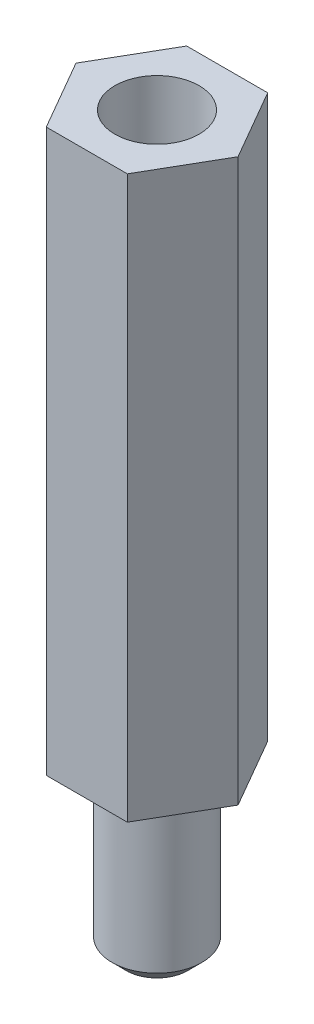
ISO-10303-21;
HEADER;
FILE_DESCRIPTION(('STEP AP214'),'2;1');
FILE_NAME('part.step','',(''),(''),'','','');
FILE_SCHEMA(('AUTOMOTIVE_DESIGN { 1 0 10303 214 1 1 1 1 }'));
ENDSEC;
DATA;
#1=APPLICATION_CONTEXT('core data for automotive mechanical design processes');
#2=APPLICATION_PROTOCOL_DEFINITION('international standard','automotive_design',2000,#1);
#3=PRODUCT_CONTEXT('',#1,'mechanical');
#4=PRODUCT('Part','Part','',(#3));
#5=PRODUCT_RELATED_PRODUCT_CATEGORY('part','',(#4));
#6=PRODUCT_DEFINITION_FORMATION('','',#4);
#7=PRODUCT_DEFINITION_CONTEXT('part definition',#1,'design');
#8=PRODUCT_DEFINITION('design','',#6,#7);
#9=PRODUCT_DEFINITION_SHAPE('','',#8);
#10=(LENGTH_UNIT() NAMED_UNIT(*) SI_UNIT(.MILLI.,.METRE.));
#11=(NAMED_UNIT(*) PLANE_ANGLE_UNIT() SI_UNIT($,.RADIAN.));
#12=(NAMED_UNIT(*) SI_UNIT($,.STERADIAN.) SOLID_ANGLE_UNIT());
#13=UNCERTAINTY_MEASURE_WITH_UNIT(LENGTH_MEASURE(1.E-05),#10,'distance_accuracy_value','');
#14=(GEOMETRIC_REPRESENTATION_CONTEXT(3) GLOBAL_UNCERTAINTY_ASSIGNED_CONTEXT((#13)) GLOBAL_UNIT_ASSIGNED_CONTEXT((#10,
#11,#12)) REPRESENTATION_CONTEXT('',''));
#15=CARTESIAN_POINT('',(0.,0.,0.));
#16=DIRECTION('',(0.,0.,1.));
#17=DIRECTION('',(1.,0.,0.));
#18=AXIS2_PLACEMENT_3D('',#15,#16,#17);
#19=CARTESIAN_POINT('',(0.,20.,0.));
#20=DIRECTION('',(0.,-1.,0.));
#21=DIRECTION('',(0.,0.,-1.));
#22=AXIS2_PLACEMENT_3D('',#19,#20,#21);
#23=CYLINDRICAL_SURFACE('',#22,1.5);
#24=CARTESIAN_POINT('',(0.,13.,0.));
#25=DIRECTION('',(0.,-1.,0.));
#26=DIRECTION('',(0.,0.,-1.));
#27=AXIS2_PLACEMENT_3D('',#24,#25,#26);
#28=CIRCLE('',#27,1.5);
#29=CARTESIAN_POINT('',(0.,13.,-1.5));
#30=VERTEX_POINT('',#29);
#31=EDGE_CURVE('E43',#30,#30,#28,.T.);
#32=ORIENTED_EDGE('',*,*,#31,.T.);
#33=EDGE_LOOP('',(#32));
#34=FACE_BOUND('',#33,.T.);
#35=CARTESIAN_POINT('',(0.,20.,0.));
#36=DIRECTION('',(0.,1.,0.));
#37=DIRECTION('',(0.,0.,1.));
#38=AXIS2_PLACEMENT_3D('',#35,#36,#37);
#39=CIRCLE('',#38,1.5);
#40=CARTESIAN_POINT('',(0.,20.,1.5));
#41=VERTEX_POINT('',#40);
#42=EDGE_CURVE('E125',#41,#41,#39,.T.);
#43=ORIENTED_EDGE('',*,*,#42,.T.);
#44=EDGE_LOOP('',(#43));
#45=FACE_BOUND('',#44,.T.);
#46=ADVANCED_FACE('F34',(#34,#45),#23,.F.);
#47=CARTESIAN_POINT('',(0.,20.,-5.));
#48=DIRECTION('',(0.,1.,0.));
#49=DIRECTION('',(0.,0.,1.));
#50=AXIS2_PLACEMENT_3D('',#47,#48,#49);
#51=PLANE('',#50);
#52=DIRECTION('',(-0.5,0.,-0.866025403784439));
#53=VECTOR('',#52,1.);
#54=CARTESIAN_POINT('',(1.44337567297406,20.,-2.5));
#55=LINE('',#54,#53);
#56=CARTESIAN_POINT('',(2.88675134594813,20.,0.));
#57=VERTEX_POINT('',#56);
#58=CARTESIAN_POINT('',(1.44337567297406,20.,-2.5));
#59=VERTEX_POINT('',#58);
#60=EDGE_CURVE('E132',#57,#59,#55,.T.);
#61=ORIENTED_EDGE('',*,*,#60,.T.);
#62=DIRECTION('',(-1.,0.,0.));
#63=VECTOR('',#62,1.);
#64=CARTESIAN_POINT('',(-1.44337567297406,20.,-2.5));
#65=LINE('',#64,#63);
#66=CARTESIAN_POINT('',(-1.44337567297406,20.,-2.5));
#67=VERTEX_POINT('',#66);
#68=EDGE_CURVE('E89',#59,#67,#65,.T.);
#69=ORIENTED_EDGE('',*,*,#68,.T.);
#70=DIRECTION('',(-0.5,0.,0.866025403784438));
#71=VECTOR('',#70,1.);
#72=CARTESIAN_POINT('',(-2.88675134594813,20.,0.));
#73=LINE('',#72,#71);
#74=CARTESIAN_POINT('',(-2.88675134594813,20.,0.));
#75=VERTEX_POINT('',#74);
#76=EDGE_CURVE('E103',#67,#75,#73,.T.);
#77=ORIENTED_EDGE('',*,*,#76,.T.);
#78=DIRECTION('',(0.5,0.,0.866025403784438));
#79=VECTOR('',#78,1.);
#80=CARTESIAN_POINT('',(-1.44337567297406,20.,2.5));
#81=LINE('',#80,#79);
#82=CARTESIAN_POINT('',(-1.44337567297406,20.,2.5));
#83=VERTEX_POINT('',#82);
#84=EDGE_CURVE('E96',#75,#83,#81,.T.);
#85=ORIENTED_EDGE('',*,*,#84,.T.);
#86=DIRECTION('',(1.,0.,0.));
#87=VECTOR('',#86,1.);
#88=CARTESIAN_POINT('',(1.44337567297406,20.,2.5));
#89=LINE('',#88,#87);
#90=CARTESIAN_POINT('',(1.44337567297406,20.,2.5));
#91=VERTEX_POINT('',#90);
#92=EDGE_CURVE('E101',#83,#91,#89,.T.);
#93=ORIENTED_EDGE('',*,*,#92,.T.);
#94=DIRECTION('',(0.5,0.,-0.866025403784439));
#95=VECTOR('',#94,1.);
#96=CARTESIAN_POINT('',(2.88675134594813,20.,0.));
#97=LINE('',#96,#95);
#98=EDGE_CURVE('E51',#91,#57,#97,.T.);
#99=ORIENTED_EDGE('',*,*,#98,.T.);
#100=EDGE_LOOP('',(#61,#69,#77,#85,#93,#99));
#101=FACE_BOUND('',#100,.T.);
#102=ORIENTED_EDGE('',*,*,#42,.F.);
#103=EDGE_LOOP('',(#102));
#104=FACE_BOUND('',#103,.T.);
#105=ADVANCED_FACE('F98',(#101,#104),#51,.T.);
#106=CARTESIAN_POINT('',(0.,0.,-5.));
#107=DIRECTION('',(0.,1.,0.));
#108=DIRECTION('',(0.,0.,1.));
#109=AXIS2_PLACEMENT_3D('',#106,#107,#108);
#110=PLANE('',#109);
#111=CARTESIAN_POINT('',(0.,0.,0.));
#112=DIRECTION('',(0.,1.,0.));
#113=DIRECTION('',(0.,0.,1.));
#114=AXIS2_PLACEMENT_3D('',#111,#112,#113);
#115=CIRCLE('',#114,2.1);
#116=CARTESIAN_POINT('',(0.,0.,2.1));
#117=VERTEX_POINT('',#116);
#118=EDGE_CURVE('E147',#117,#117,#115,.T.);
#119=ORIENTED_EDGE('',*,*,#118,.T.);
#120=EDGE_LOOP('',(#119));
#121=FACE_BOUND('',#120,.T.);
#122=DIRECTION('',(-0.5,0.,-0.866025403784439));
#123=VECTOR('',#122,1.);
#124=CARTESIAN_POINT('',(1.44337567297406,0.,-2.5));
#125=LINE('',#124,#123);
#126=CARTESIAN_POINT('',(2.88675134594813,0.,0.));
#127=VERTEX_POINT('',#126);
#128=CARTESIAN_POINT('',(1.44337567297406,0.,-2.5));
#129=VERTEX_POINT('',#128);
#130=EDGE_CURVE('E121',#127,#129,#125,.T.);
#131=ORIENTED_EDGE('',*,*,#130,.F.);
#132=DIRECTION('',(0.5,0.,-0.866025403784439));
#133=VECTOR('',#132,1.);
#134=CARTESIAN_POINT('',(2.88675134594813,0.,0.));
#135=LINE('',#134,#133);
#136=CARTESIAN_POINT('',(1.44337567297406,0.,2.5));
#137=VERTEX_POINT('',#136);
#138=EDGE_CURVE('E80',#137,#127,#135,.T.);
#139=ORIENTED_EDGE('',*,*,#138,.F.);
#140=DIRECTION('',(1.,0.,0.));
#141=VECTOR('',#140,1.);
#142=CARTESIAN_POINT('',(1.44337567297406,0.,2.5));
#143=LINE('',#142,#141);
#144=CARTESIAN_POINT('',(-1.44337567297406,0.,2.5));
#145=VERTEX_POINT('',#144);
#146=EDGE_CURVE('E74',#145,#137,#143,.T.);
#147=ORIENTED_EDGE('',*,*,#146,.F.);
#148=DIRECTION('',(0.5,0.,0.866025403784438));
#149=VECTOR('',#148,1.);
#150=CARTESIAN_POINT('',(-1.44337567297406,0.,2.5));
#151=LINE('',#150,#149);
#152=CARTESIAN_POINT('',(-2.88675134594813,0.,0.));
#153=VERTEX_POINT('',#152);
#154=EDGE_CURVE('E111',#153,#145,#151,.T.);
#155=ORIENTED_EDGE('',*,*,#154,.F.);
#156=DIRECTION('',(-0.5,0.,0.866025403784438));
#157=VECTOR('',#156,1.);
#158=CARTESIAN_POINT('',(-2.88675134594813,0.,0.));
#159=LINE('',#158,#157);
#160=CARTESIAN_POINT('',(-1.44337567297406,0.,-2.5));
#161=VERTEX_POINT('',#160);
#162=EDGE_CURVE('E127',#161,#153,#159,.T.);
#163=ORIENTED_EDGE('',*,*,#162,.F.);
#164=DIRECTION('',(-1.,0.,0.));
#165=VECTOR('',#164,1.);
#166=CARTESIAN_POINT('',(-1.44337567297406,0.,-2.5));
#167=LINE('',#166,#165);
#168=EDGE_CURVE('E124',#129,#161,#167,.T.);
#169=ORIENTED_EDGE('',*,*,#168,.F.);
#170=EDGE_LOOP('',(#131,#139,#147,#155,#163,#169));
#171=FACE_BOUND('',#170,.T.);
#172=ADVANCED_FACE('F171',(#121,#171),#110,.F.);
#173=CARTESIAN_POINT('',(1.44337567297406,20.,-2.5));
#174=DIRECTION('',(-0.866025403784439,0.,0.5));
#175=DIRECTION('',(0.5,0.,0.866025403784439));
#176=AXIS2_PLACEMENT_3D('',#173,#174,#175);
#177=PLANE('',#176);
#178=ORIENTED_EDGE('',*,*,#130,.T.);
#179=DIRECTION('',(0.,-1.,0.));
#180=VECTOR('',#179,1.);
#181=CARTESIAN_POINT('',(1.44337567297406,20.,-2.5));
#182=LINE('',#181,#180);
#183=EDGE_CURVE('E139',#59,#129,#182,.T.);
#184=ORIENTED_EDGE('',*,*,#183,.F.);
#185=ORIENTED_EDGE('',*,*,#60,.F.);
#186=DIRECTION('',(0.,-1.,0.));
#187=VECTOR('',#186,1.);
#188=CARTESIAN_POINT('',(2.88675134594813,20.,0.));
#189=LINE('',#188,#187);
#190=EDGE_CURVE('E117',#57,#127,#189,.T.);
#191=ORIENTED_EDGE('',*,*,#190,.T.);
#192=EDGE_LOOP('',(#178,#184,#185,#191));
#193=FACE_BOUND('',#192,.T.);
#194=ADVANCED_FACE('F179',(#193),#177,.F.);
#195=CARTESIAN_POINT('',(-1.44337567297406,20.,-2.5));
#196=DIRECTION('',(0.,0.,1.));
#197=DIRECTION('',(1.,0.,0.));
#198=AXIS2_PLACEMENT_3D('',#195,#196,#197);
#199=PLANE('',#198);
#200=ORIENTED_EDGE('',*,*,#168,.T.);
#201=DIRECTION('',(0.,-1.,0.));
#202=VECTOR('',#201,1.);
#203=CARTESIAN_POINT('',(-1.44337567297406,20.,-2.5));
#204=LINE('',#203,#202);
#205=EDGE_CURVE('E136',#67,#161,#204,.T.);
#206=ORIENTED_EDGE('',*,*,#205,.F.);
#207=ORIENTED_EDGE('',*,*,#68,.F.);
#208=ORIENTED_EDGE('',*,*,#183,.T.);
#209=EDGE_LOOP('',(#200,#206,#207,#208));
#210=FACE_BOUND('',#209,.T.);
#211=ADVANCED_FACE('F192',(#210),#199,.F.);
#212=CARTESIAN_POINT('',(-2.88675134594813,20.,0.));
#213=DIRECTION('',(0.866025403784439,0.,0.5));
#214=DIRECTION('',(0.5,0.,-0.866025403784439));
#215=AXIS2_PLACEMENT_3D('',#212,#213,#214);
#216=PLANE('',#215);
#217=ORIENTED_EDGE('',*,*,#162,.T.);
#218=DIRECTION('',(0.,-1.,0.));
#219=VECTOR('',#218,1.);
#220=CARTESIAN_POINT('',(-2.88675134594813,20.,0.));
#221=LINE('',#220,#219);
#222=EDGE_CURVE('E112',#75,#153,#221,.T.);
#223=ORIENTED_EDGE('',*,*,#222,.F.);
#224=ORIENTED_EDGE('',*,*,#76,.F.);
#225=ORIENTED_EDGE('',*,*,#205,.T.);
#226=EDGE_LOOP('',(#217,#223,#224,#225));
#227=FACE_BOUND('',#226,.T.);
#228=ADVANCED_FACE('F189',(#227),#216,.F.);
#229=CARTESIAN_POINT('',(-1.44337567297406,20.,2.5));
#230=DIRECTION('',(0.866025403784438,0.,-0.5));
#231=DIRECTION('',(-0.5,0.,-0.866025403784438));
#232=AXIS2_PLACEMENT_3D('',#229,#230,#231);
#233=PLANE('',#232);
#234=ORIENTED_EDGE('',*,*,#154,.T.);
#235=DIRECTION('',(0.,-1.,0.));
#236=VECTOR('',#235,1.);
#237=CARTESIAN_POINT('',(-1.44337567297406,20.,2.5));
#238=LINE('',#237,#236);
#239=EDGE_CURVE('E108',#83,#145,#238,.T.);
#240=ORIENTED_EDGE('',*,*,#239,.F.);
#241=ORIENTED_EDGE('',*,*,#84,.F.);
#242=ORIENTED_EDGE('',*,*,#222,.T.);
#243=EDGE_LOOP('',(#234,#240,#241,#242));
#244=FACE_BOUND('',#243,.T.);
#245=ADVANCED_FACE('F109',(#244),#233,.F.);
#246=CARTESIAN_POINT('',(1.44337567297406,20.,2.5));
#247=DIRECTION('',(0.,0.,-1.));
#248=DIRECTION('',(-1.,0.,0.));
#249=AXIS2_PLACEMENT_3D('',#246,#247,#248);
#250=PLANE('',#249);
#251=ORIENTED_EDGE('',*,*,#146,.T.);
#252=DIRECTION('',(0.,-1.,0.));
#253=VECTOR('',#252,1.);
#254=CARTESIAN_POINT('',(1.44337567297406,20.,2.5));
#255=LINE('',#254,#253);
#256=EDGE_CURVE('E113',#91,#137,#255,.T.);
#257=ORIENTED_EDGE('',*,*,#256,.F.);
#258=ORIENTED_EDGE('',*,*,#92,.F.);
#259=ORIENTED_EDGE('',*,*,#239,.T.);
#260=EDGE_LOOP('',(#251,#257,#258,#259));
#261=FACE_BOUND('',#260,.T.);
#262=ADVANCED_FACE('F115',(#261),#250,.F.);
#263=CARTESIAN_POINT('',(2.88675134594813,20.,0.));
#264=DIRECTION('',(-0.866025403784439,0.,-0.5));
#265=DIRECTION('',(-0.5,0.,0.866025403784439));
#266=AXIS2_PLACEMENT_3D('',#263,#264,#265);
#267=PLANE('',#266);
#268=ORIENTED_EDGE('',*,*,#138,.T.);
#269=ORIENTED_EDGE('',*,*,#190,.F.);
#270=ORIENTED_EDGE('',*,*,#98,.F.);
#271=ORIENTED_EDGE('',*,*,#256,.T.);
#272=EDGE_LOOP('',(#268,#269,#270,#271));
#273=FACE_BOUND('',#272,.T.);
#274=ADVANCED_FACE('F181',(#273),#267,.F.);
#275=CARTESIAN_POINT('',(0.,12.,0.));
#276=DIRECTION('',(0.,-1.,0.));
#277=DIRECTION('',(0.,0.,-1.));
#278=AXIS2_PLACEMENT_3D('',#275,#276,#277);
#279=PLANE('',#278);
#280=CARTESIAN_POINT('',(0.,12.,0.));
#281=DIRECTION('',(0.,-1.,0.));
#282=DIRECTION('',(0.,0.,-1.));
#283=AXIS2_PLACEMENT_3D('',#280,#281,#282);
#284=CIRCLE('',#283,0.5);
#285=CARTESIAN_POINT('',(0.,12.,-0.5));
#286=VERTEX_POINT('',#285);
#287=EDGE_CURVE('E11',#286,#286,#284,.F.);
#288=ORIENTED_EDGE('',*,*,#287,.T.);
#289=EDGE_LOOP('',(#288));
#290=FACE_BOUND('',#289,.T.);
#291=ADVANCED_FACE('F184',(#290),#279,.F.);
#292=CARTESIAN_POINT('',(0.,12.,0.));
#293=DIRECTION('',(0.,-1.,0.));
#294=DIRECTION('',(0.,0.,-1.));
#295=AXIS2_PLACEMENT_3D('',#292,#293,#294);
#296=CYLINDRICAL_SURFACE('',#295,1.6);
#297=CARTESIAN_POINT('',(0.,-0.5,0.));
#298=DIRECTION('',(0.,1.,0.));
#299=DIRECTION('',(0.,0.,1.));
#300=AXIS2_PLACEMENT_3D('',#297,#298,#299);
#301=CIRCLE('',#300,1.6);
#302=CARTESIAN_POINT('',(0.,-0.5,1.6));
#303=VERTEX_POINT('',#302);
#304=EDGE_CURVE('E150',#303,#303,#301,.F.);
#305=ORIENTED_EDGE('',*,*,#304,.T.);
#306=EDGE_LOOP('',(#305));
#307=FACE_BOUND('',#306,.T.);
#308=CARTESIAN_POINT('',(0.,-5.5,0.));
#309=DIRECTION('',(0.,-1.,0.));
#310=DIRECTION('',(0.,0.,-1.));
#311=AXIS2_PLACEMENT_3D('',#308,#309,#310);
#312=CIRCLE('',#311,1.6);
#313=CARTESIAN_POINT('',(0.,-5.5,-1.6));
#314=VERTEX_POINT('',#313);
#315=EDGE_CURVE('E144',#314,#314,#312,.F.);
#316=ORIENTED_EDGE('',*,*,#315,.T.);
#317=EDGE_LOOP('',(#316));
#318=FACE_BOUND('',#317,.T.);
#319=ADVANCED_FACE('F174',(#307,#318),#296,.T.);
#320=CARTESIAN_POINT('',(0.,-6.,0.));
#321=DIRECTION('',(0.,-1.,0.));
#322=DIRECTION('',(0.,0.,-1.));
#323=AXIS2_PLACEMENT_3D('',#320,#321,#322);
#324=PLANE('',#323);
#325=CARTESIAN_POINT('',(0.,-6.,0.));
#326=DIRECTION('',(0.,-1.,0.));
#327=DIRECTION('',(0.,0.,-1.));
#328=AXIS2_PLACEMENT_3D('',#325,#326,#327);
#329=CIRCLE('',#328,1.10000000000001);
#330=CARTESIAN_POINT('',(0.,-6.,-1.10000000000001));
#331=VERTEX_POINT('',#330);
#332=EDGE_CURVE('E141',#331,#331,#329,.T.);
#333=ORIENTED_EDGE('',*,*,#332,.T.);
#334=EDGE_LOOP('',(#333));
#335=FACE_BOUND('',#334,.T.);
#336=ADVANCED_FACE('F200',(#335),#324,.T.);
#337=CARTESIAN_POINT('',(0.,-6.,0.));
#338=DIRECTION('',(0.,1.,0.));
#339=DIRECTION('',(0.,0.,1.));
#340=AXIS2_PLACEMENT_3D('',#337,#338,#339);
#341=CONICAL_SURFACE('',#340,1.1,0.785398163397444);
#342=ORIENTED_EDGE('',*,*,#315,.F.);
#343=EDGE_LOOP('',(#342));
#344=FACE_BOUND('',#343,.T.);
#345=ORIENTED_EDGE('',*,*,#332,.F.);
#346=EDGE_LOOP('',(#345));
#347=FACE_BOUND('',#346,.T.);
#348=ADVANCED_FACE('F163',(#344,#347),#341,.T.);
#349=CARTESIAN_POINT('',(0.,-0.5,0.));
#350=DIRECTION('',(0.,1.,0.));
#351=DIRECTION('',(0.,0.,1.));
#352=AXIS2_PLACEMENT_3D('',#349,#350,#351);
#353=TOROIDAL_SURFACE('',#352,2.1,0.5);
#354=ORIENTED_EDGE('',*,*,#304,.F.);
#355=EDGE_LOOP('',(#354));
#356=FACE_BOUND('',#355,.T.);
#357=ORIENTED_EDGE('',*,*,#118,.F.);
#358=EDGE_LOOP('',(#357));
#359=FACE_BOUND('',#358,.T.);
#360=ADVANCED_FACE('F158',(#356,#359),#353,.F.);
#361=CARTESIAN_POINT('',(0.,13.,0.));
#362=DIRECTION('',(0.,-1.,0.));
#363=DIRECTION('',(0.,0.,-1.));
#364=AXIS2_PLACEMENT_3D('',#361,#362,#363);
#365=DEGENERATE_TOROIDAL_SURFACE('',#364,0.5,1.,.T.);
#366=ORIENTED_EDGE('',*,*,#287,.F.);
#367=EDGE_LOOP('',(#366));
#368=FACE_BOUND('',#367,.T.);
#369=ORIENTED_EDGE('',*,*,#31,.F.);
#370=EDGE_LOOP('',(#369));
#371=FACE_BOUND('',#370,.T.);
#372=ADVANCED_FACE('F36',(#368,#371),#365,.F.);
#373=CLOSED_SHELL('',(#46,#105,#172,#194,#211,#228,#245,#262,#274,#291,#319,#336,#348,#360,#372));
#374=MANIFOLD_SOLID_BREP('B2',#373);
#375=ADVANCED_BREP_SHAPE_REPRESENTATION('',(#18,#374),#14);
#376=SHAPE_DEFINITION_REPRESENTATION(#9,#375);
ENDSEC;
END-ISO-10303-21;
